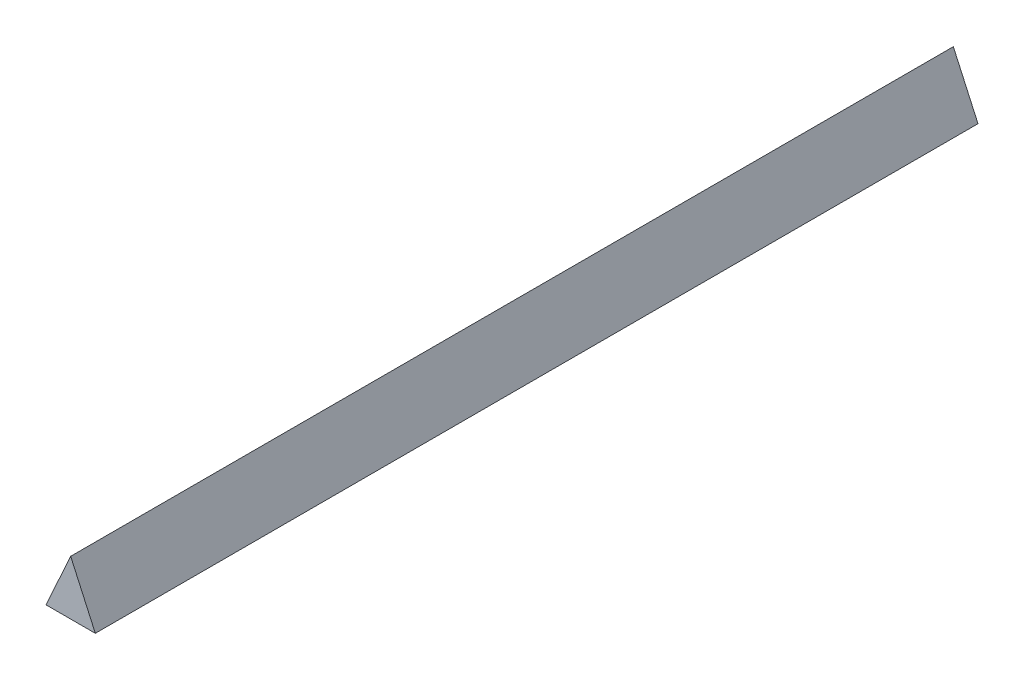
ISO-10303-21;
HEADER;
FILE_DESCRIPTION(('STEP AP214'),'2;1');
FILE_NAME('part.step','',(''),(''),'','','');
FILE_SCHEMA(('AUTOMOTIVE_DESIGN { 1 0 10303 214 1 1 1 1 }'));
ENDSEC;
DATA;
#1=APPLICATION_CONTEXT('core data for automotive mechanical design processes');
#2=APPLICATION_PROTOCOL_DEFINITION('international standard','automotive_design',2000,#1);
#3=PRODUCT_CONTEXT('',#1,'mechanical');
#4=PRODUCT('Part','Part','',(#3));
#5=PRODUCT_RELATED_PRODUCT_CATEGORY('part','',(#4));
#6=PRODUCT_DEFINITION_FORMATION('','',#4);
#7=PRODUCT_DEFINITION_CONTEXT('part definition',#1,'design');
#8=PRODUCT_DEFINITION('design','',#6,#7);
#9=PRODUCT_DEFINITION_SHAPE('','',#8);
#10=(LENGTH_UNIT() NAMED_UNIT(*) SI_UNIT(.MILLI.,.METRE.));
#11=(NAMED_UNIT(*) PLANE_ANGLE_UNIT() SI_UNIT($,.RADIAN.));
#12=(NAMED_UNIT(*) SI_UNIT($,.STERADIAN.) SOLID_ANGLE_UNIT());
#13=UNCERTAINTY_MEASURE_WITH_UNIT(LENGTH_MEASURE(1.E-05),#10,'distance_accuracy_value','');
#14=(GEOMETRIC_REPRESENTATION_CONTEXT(3) GLOBAL_UNCERTAINTY_ASSIGNED_CONTEXT((#13)) GLOBAL_UNIT_ASSIGNED_CONTEXT((#10,
#11,#12)) REPRESENTATION_CONTEXT('',''));
#15=CARTESIAN_POINT('',(0.,0.,0.));
#16=DIRECTION('',(0.,0.,1.));
#17=DIRECTION('',(1.,0.,0.));
#18=AXIS2_PLACEMENT_3D('',#15,#16,#17);
#19=CARTESIAN_POINT('',(0.,2.09463600656534,34.));
#20=DIRECTION('',(0.910711307202322,-0.41304347826087,0.));
#21=DIRECTION('',(0.41304347826087,0.910711307202322,0.));
#22=AXIS2_PLACEMENT_3D('',#19,#20,#21);
#23=PLANE('',#22);
#24=DIRECTION('',(-0.41304347826087,-0.910711307202322,0.));
#25=VECTOR('',#24,1.);
#26=CARTESIAN_POINT('',(0.,2.09463600656534,0.));
#27=LINE('',#26,#25);
#28=CARTESIAN_POINT('',(0.,2.09463600656534,0.));
#29=VERTEX_POINT('',#28);
#30=CARTESIAN_POINT('',(-0.95,0.,0.));
#31=VERTEX_POINT('',#30);
#32=EDGE_CURVE('E86',#29,#31,#27,.T.);
#33=ORIENTED_EDGE('',*,*,#32,.T.);
#34=DIRECTION('',(0.,0.,-1.));
#35=VECTOR('',#34,1.);
#36=CARTESIAN_POINT('',(-0.95,0.,34.));
#37=LINE('',#36,#35);
#38=CARTESIAN_POINT('',(-0.95,0.,34.));
#39=VERTEX_POINT('',#38);
#40=EDGE_CURVE('E11',#39,#31,#37,.T.);
#41=ORIENTED_EDGE('',*,*,#40,.F.);
#42=DIRECTION('',(-0.41304347826087,-0.910711307202322,0.));
#43=VECTOR('',#42,1.);
#44=CARTESIAN_POINT('',(0.,2.09463600656534,34.));
#45=LINE('',#44,#43);
#46=CARTESIAN_POINT('',(0.,2.09463600656534,34.));
#47=VERTEX_POINT('',#46);
#48=EDGE_CURVE('E79',#47,#39,#45,.T.);
#49=ORIENTED_EDGE('',*,*,#48,.F.);
#50=DIRECTION('',(0.,0.,-1.));
#51=VECTOR('',#50,1.);
#52=CARTESIAN_POINT('',(0.,2.09463600656534,34.));
#53=LINE('',#52,#51);
#54=EDGE_CURVE('E87',#47,#29,#53,.T.);
#55=ORIENTED_EDGE('',*,*,#54,.T.);
#56=EDGE_LOOP('',(#33,#41,#49,#55));
#57=FACE_BOUND('',#56,.T.);
#58=ADVANCED_FACE('F39',(#57),#23,.F.);
#59=CARTESIAN_POINT('',(-0.95,0.,34.));
#60=DIRECTION('',(0.,1.,0.));
#61=DIRECTION('',(0.,0.,1.));
#62=AXIS2_PLACEMENT_3D('',#59,#60,#61);
#63=PLANE('',#62);
#64=DIRECTION('',(1.,0.,0.));
#65=VECTOR('',#64,1.);
#66=CARTESIAN_POINT('',(-0.95,0.,0.));
#67=LINE('',#66,#65);
#68=CARTESIAN_POINT('',(0.95,0.,0.));
#69=VERTEX_POINT('',#68);
#70=EDGE_CURVE('E67',#31,#69,#67,.T.);
#71=ORIENTED_EDGE('',*,*,#70,.T.);
#72=DIRECTION('',(0.,0.,-1.));
#73=VECTOR('',#72,1.);
#74=CARTESIAN_POINT('',(0.95,0.,34.));
#75=LINE('',#74,#73);
#76=CARTESIAN_POINT('',(0.95,0.,34.));
#77=VERTEX_POINT('',#76);
#78=EDGE_CURVE('E47',#77,#69,#75,.T.);
#79=ORIENTED_EDGE('',*,*,#78,.F.);
#80=DIRECTION('',(1.,0.,0.));
#81=VECTOR('',#80,1.);
#82=CARTESIAN_POINT('',(-0.95,0.,34.));
#83=LINE('',#82,#81);
#84=EDGE_CURVE('E75',#39,#77,#83,.T.);
#85=ORIENTED_EDGE('',*,*,#84,.F.);
#86=ORIENTED_EDGE('',*,*,#40,.T.);
#87=EDGE_LOOP('',(#71,#79,#85,#86));
#88=FACE_BOUND('',#87,.T.);
#89=ADVANCED_FACE('F76',(#88),#63,.F.);
#90=CARTESIAN_POINT('',(0.95,0.,34.));
#91=DIRECTION('',(-0.910711307202322,-0.41304347826087,0.));
#92=DIRECTION('',(0.41304347826087,-0.910711307202322,0.));
#93=AXIS2_PLACEMENT_3D('',#90,#91,#92);
#94=PLANE('',#93);
#95=DIRECTION('',(-0.41304347826087,0.910711307202322,0.));
#96=VECTOR('',#95,1.);
#97=CARTESIAN_POINT('',(0.95,0.,0.));
#98=LINE('',#97,#96);
#99=EDGE_CURVE('E72',#69,#29,#98,.T.);
#100=ORIENTED_EDGE('',*,*,#99,.T.);
#101=ORIENTED_EDGE('',*,*,#54,.F.);
#102=DIRECTION('',(-0.41304347826087,0.910711307202322,0.));
#103=VECTOR('',#102,1.);
#104=CARTESIAN_POINT('',(0.95,0.,34.));
#105=LINE('',#104,#103);
#106=EDGE_CURVE('E55',#77,#47,#105,.T.);
#107=ORIENTED_EDGE('',*,*,#106,.F.);
#108=ORIENTED_EDGE('',*,*,#78,.T.);
#109=EDGE_LOOP('',(#100,#101,#107,#108));
#110=FACE_BOUND('',#109,.T.);
#111=ADVANCED_FACE('F94',(#110),#94,.F.);
#112=CARTESIAN_POINT('',(0.,0.,34.));
#113=DIRECTION('',(0.,0.,1.));
#114=DIRECTION('',(1.,0.,0.));
#115=AXIS2_PLACEMENT_3D('',#112,#113,#114);
#116=PLANE('',#115);
#117=ORIENTED_EDGE('',*,*,#48,.T.);
#118=ORIENTED_EDGE('',*,*,#84,.T.);
#119=ORIENTED_EDGE('',*,*,#106,.T.);
#120=EDGE_LOOP('',(#117,#118,#119));
#121=FACE_BOUND('',#120,.T.);
#122=ADVANCED_FACE('F82',(#121),#116,.T.);
#123=CARTESIAN_POINT('',(0.,0.,0.));
#124=DIRECTION('',(0.,0.,1.));
#125=DIRECTION('',(1.,0.,0.));
#126=AXIS2_PLACEMENT_3D('',#123,#124,#125);
#127=PLANE('',#126);
#128=ORIENTED_EDGE('',*,*,#32,.F.);
#129=ORIENTED_EDGE('',*,*,#99,.F.);
#130=ORIENTED_EDGE('',*,*,#70,.F.);
#131=EDGE_LOOP('',(#128,#129,#130));
#132=FACE_BOUND('',#131,.T.);
#133=ADVANCED_FACE('F95',(#132),#127,.F.);
#134=CLOSED_SHELL('',(#58,#89,#111,#122,#133));
#135=MANIFOLD_SOLID_BREP('B2',#134);
#136=ADVANCED_BREP_SHAPE_REPRESENTATION('',(#18,#135),#14);
#137=SHAPE_DEFINITION_REPRESENTATION(#9,#136);
ENDSEC;
END-ISO-10303-21;
